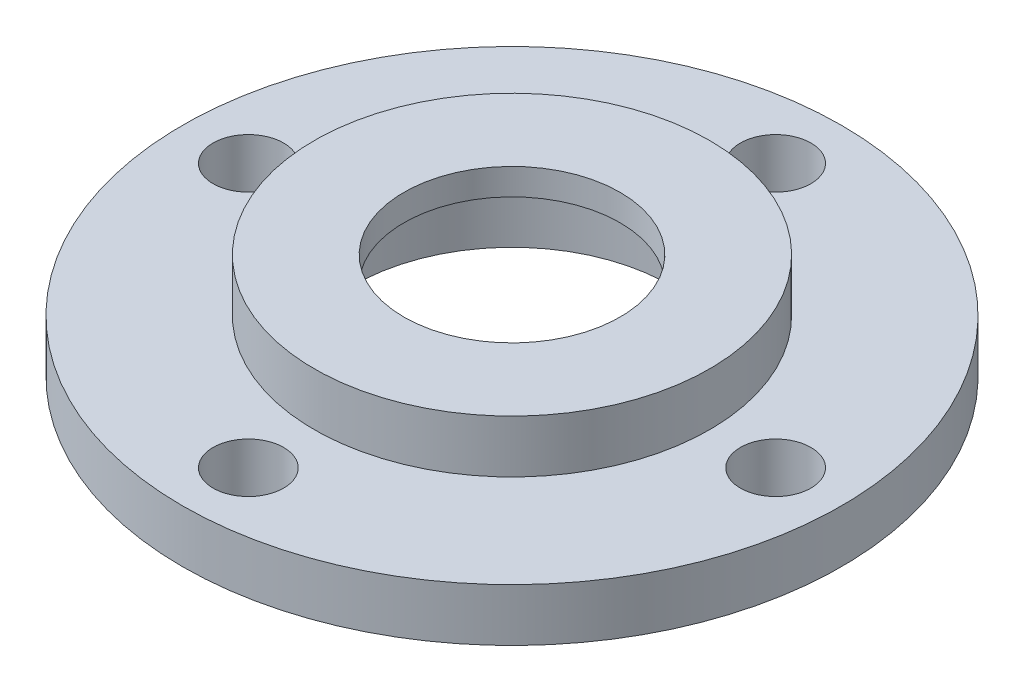
ISO-10303-21;
HEADER;
FILE_DESCRIPTION(('STEP AP214'),'2;1');
FILE_NAME('part.step','',(''),(''),'','','');
FILE_SCHEMA(('AUTOMOTIVE_DESIGN { 1 0 10303 214 1 1 1 1 }'));
ENDSEC;
DATA;
#1=APPLICATION_CONTEXT('core data for automotive mechanical design processes');
#2=APPLICATION_PROTOCOL_DEFINITION('international standard','automotive_design',2000,#1);
#3=PRODUCT_CONTEXT('',#1,'mechanical');
#4=PRODUCT('Part','Part','',(#3));
#5=PRODUCT_RELATED_PRODUCT_CATEGORY('part','',(#4));
#6=PRODUCT_DEFINITION_FORMATION('','',#4);
#7=PRODUCT_DEFINITION_CONTEXT('part definition',#1,'design');
#8=PRODUCT_DEFINITION('design','',#6,#7);
#9=PRODUCT_DEFINITION_SHAPE('','',#8);
#10=(LENGTH_UNIT() NAMED_UNIT(*) SI_UNIT(.MILLI.,.METRE.));
#11=(NAMED_UNIT(*) PLANE_ANGLE_UNIT() SI_UNIT($,.RADIAN.));
#12=(NAMED_UNIT(*) SI_UNIT($,.STERADIAN.) SOLID_ANGLE_UNIT());
#13=UNCERTAINTY_MEASURE_WITH_UNIT(LENGTH_MEASURE(1.E-05),#10,'distance_accuracy_value','');
#14=(GEOMETRIC_REPRESENTATION_CONTEXT(3) GLOBAL_UNCERTAINTY_ASSIGNED_CONTEXT((#13)) GLOBAL_UNIT_ASSIGNED_CONTEXT((#10,
#11,#12)) REPRESENTATION_CONTEXT('',''));
#15=CARTESIAN_POINT('',(0.,0.,0.));
#16=DIRECTION('',(0.,0.,1.));
#17=DIRECTION('',(1.,0.,0.));
#18=AXIS2_PLACEMENT_3D('',#15,#16,#17);
#19=CARTESIAN_POINT('',(0.,2.54,0.));
#20=DIRECTION('',(0.,-1.,0.));
#21=DIRECTION('',(0.,0.,1.));
#22=AXIS2_PLACEMENT_3D('',#19,#20,#21);
#23=CYLINDRICAL_SURFACE('',#22,15.875);
#24=CARTESIAN_POINT('',(0.,2.54,0.));
#25=DIRECTION('',(0.,-1.,0.));
#26=DIRECTION('',(0.,0.,-1.));
#27=AXIS2_PLACEMENT_3D('',#24,#25,#26);
#28=CIRCLE('',#27,15.875);
#29=CARTESIAN_POINT('',(0.,2.54,-15.875));
#30=VERTEX_POINT('',#29);
#31=EDGE_CURVE('E41',#30,#30,#28,.T.);
#32=ORIENTED_EDGE('',*,*,#31,.T.);
#33=EDGE_LOOP('',(#32));
#34=FACE_BOUND('',#33,.T.);
#35=CARTESIAN_POINT('',(0.,0.,0.));
#36=DIRECTION('',(0.,-1.,0.));
#37=DIRECTION('',(0.,0.,-1.));
#38=AXIS2_PLACEMENT_3D('',#35,#36,#37);
#39=CIRCLE('',#38,15.875);
#40=CARTESIAN_POINT('',(0.,0.,-15.875));
#41=VERTEX_POINT('',#40);
#42=EDGE_CURVE('E37',#41,#41,#39,.T.);
#43=ORIENTED_EDGE('',*,*,#42,.F.);
#44=EDGE_LOOP('',(#43));
#45=FACE_BOUND('',#44,.T.);
#46=ADVANCED_FACE('F34',(#34,#45),#23,.T.);
#47=CARTESIAN_POINT('',(0.,2.54,0.));
#48=DIRECTION('',(0.,1.,0.));
#49=DIRECTION('',(0.,0.,-1.));
#50=AXIS2_PLACEMENT_3D('',#47,#48,#49);
#51=PLANE('',#50);
#52=CARTESIAN_POINT('',(0.,2.54,12.7));
#53=DIRECTION('',(0.,-1.,0.));
#54=DIRECTION('',(0.,0.,-1.));
#55=AXIS2_PLACEMENT_3D('',#52,#53,#54);
#56=CIRCLE('',#55,1.7);
#57=CARTESIAN_POINT('',(0.,2.54,11.));
#58=VERTEX_POINT('',#57);
#59=EDGE_CURVE('E79',#58,#58,#56,.T.);
#60=ORIENTED_EDGE('',*,*,#59,.T.);
#61=EDGE_LOOP('',(#60));
#62=FACE_BOUND('',#61,.T.);
#63=CARTESIAN_POINT('',(12.7,2.54,0.));
#64=DIRECTION('',(0.,-1.,0.));
#65=DIRECTION('',(0.,0.,-1.));
#66=AXIS2_PLACEMENT_3D('',#63,#64,#65);
#67=CIRCLE('',#66,1.70000000000004);
#68=CARTESIAN_POINT('',(12.7,2.54,-1.70000000000004));
#69=VERTEX_POINT('',#68);
#70=EDGE_CURVE('E76',#69,#69,#67,.T.);
#71=ORIENTED_EDGE('',*,*,#70,.T.);
#72=EDGE_LOOP('',(#71));
#73=FACE_BOUND('',#72,.T.);
#74=CARTESIAN_POINT('',(0.,2.54,-12.7));
#75=DIRECTION('',(0.,-1.,0.));
#76=DIRECTION('',(0.,0.,-1.));
#77=AXIS2_PLACEMENT_3D('',#74,#75,#76);
#78=CIRCLE('',#77,1.7);
#79=CARTESIAN_POINT('',(0.,2.54,-14.4));
#80=VERTEX_POINT('',#79);
#81=EDGE_CURVE('E70',#80,#80,#78,.T.);
#82=ORIENTED_EDGE('',*,*,#81,.T.);
#83=EDGE_LOOP('',(#82));
#84=FACE_BOUND('',#83,.T.);
#85=CARTESIAN_POINT('',(-12.7,2.54,0.));
#86=DIRECTION('',(0.,-1.,0.));
#87=DIRECTION('',(0.,0.,-1.));
#88=AXIS2_PLACEMENT_3D('',#85,#86,#87);
#89=CIRCLE('',#88,1.7);
#90=CARTESIAN_POINT('',(-12.7,2.54,-1.7));
#91=VERTEX_POINT('',#90);
#92=EDGE_CURVE('E63',#91,#91,#89,.T.);
#93=ORIENTED_EDGE('',*,*,#92,.T.);
#94=EDGE_LOOP('',(#93));
#95=FACE_BOUND('',#94,.T.);
#96=CARTESIAN_POINT('',(0.,2.54,0.));
#97=DIRECTION('',(0.,-1.,0.));
#98=DIRECTION('',(0.,0.,-1.));
#99=AXIS2_PLACEMENT_3D('',#96,#97,#98);
#100=CIRCLE('',#99,9.525);
#101=CARTESIAN_POINT('',(0.,2.54,-9.525));
#102=VERTEX_POINT('',#101);
#103=EDGE_CURVE('E10',#102,#102,#100,.T.);
#104=ORIENTED_EDGE('',*,*,#103,.T.);
#105=EDGE_LOOP('',(#104));
#106=FACE_BOUND('',#105,.T.);
#107=ORIENTED_EDGE('',*,*,#31,.F.);
#108=EDGE_LOOP('',(#107));
#109=FACE_BOUND('',#108,.T.);
#110=ADVANCED_FACE('F87',(#62,#73,#84,#95,#106,#109),#51,.T.);
#111=CARTESIAN_POINT('',(0.,0.,0.));
#112=DIRECTION('',(0.,1.,0.));
#113=DIRECTION('',(0.,0.,-1.));
#114=AXIS2_PLACEMENT_3D('',#111,#112,#113);
#115=PLANE('',#114);
#116=CARTESIAN_POINT('',(0.,0.,12.7));
#117=DIRECTION('',(0.,-1.,0.));
#118=DIRECTION('',(0.,0.,-1.));
#119=AXIS2_PLACEMENT_3D('',#116,#117,#118);
#120=CIRCLE('',#119,1.7);
#121=CARTESIAN_POINT('',(0.,0.,11.));
#122=VERTEX_POINT('',#121);
#123=EDGE_CURVE('E60',#122,#122,#120,.F.);
#124=ORIENTED_EDGE('',*,*,#123,.T.);
#125=EDGE_LOOP('',(#124));
#126=FACE_BOUND('',#125,.T.);
#127=CARTESIAN_POINT('',(12.7,0.,0.));
#128=DIRECTION('',(0.,-1.,0.));
#129=DIRECTION('',(0.,0.,-1.));
#130=AXIS2_PLACEMENT_3D('',#127,#128,#129);
#131=CIRCLE('',#130,1.70000000000004);
#132=CARTESIAN_POINT('',(12.7,0.,-1.70000000000004));
#133=VERTEX_POINT('',#132);
#134=EDGE_CURVE('E73',#133,#133,#131,.F.);
#135=ORIENTED_EDGE('',*,*,#134,.T.);
#136=EDGE_LOOP('',(#135));
#137=FACE_BOUND('',#136,.T.);
#138=CARTESIAN_POINT('',(0.,0.,-12.7));
#139=DIRECTION('',(0.,-1.,0.));
#140=DIRECTION('',(0.,0.,-1.));
#141=AXIS2_PLACEMENT_3D('',#138,#139,#140);
#142=CIRCLE('',#141,1.7);
#143=CARTESIAN_POINT('',(0.,0.,-14.4));
#144=VERTEX_POINT('',#143);
#145=EDGE_CURVE('E66',#144,#144,#142,.F.);
#146=ORIENTED_EDGE('',*,*,#145,.T.);
#147=EDGE_LOOP('',(#146));
#148=FACE_BOUND('',#147,.T.);
#149=CARTESIAN_POINT('',(-12.7,0.,0.));
#150=DIRECTION('',(0.,-1.,0.));
#151=DIRECTION('',(0.,0.,-1.));
#152=AXIS2_PLACEMENT_3D('',#149,#150,#151);
#153=CIRCLE('',#152,1.7);
#154=CARTESIAN_POINT('',(-12.7,0.,-1.7));
#155=VERTEX_POINT('',#154);
#156=EDGE_CURVE('E67',#155,#155,#153,.F.);
#157=ORIENTED_EDGE('',*,*,#156,.T.);
#158=EDGE_LOOP('',(#157));
#159=FACE_BOUND('',#158,.T.);
#160=CARTESIAN_POINT('',(0.,0.,0.));
#161=DIRECTION('',(0.,1.,0.));
#162=DIRECTION('',(0.,0.,1.));
#163=AXIS2_PLACEMENT_3D('',#160,#161,#162);
#164=CIRCLE('',#163,7.62);
#165=CARTESIAN_POINT('',(0.,0.,7.62));
#166=VERTEX_POINT('',#165);
#167=EDGE_CURVE('E51',#166,#166,#164,.T.);
#168=ORIENTED_EDGE('',*,*,#167,.T.);
#169=EDGE_LOOP('',(#168));
#170=FACE_BOUND('',#169,.T.);
#171=ORIENTED_EDGE('',*,*,#42,.T.);
#172=EDGE_LOOP('',(#171));
#173=FACE_BOUND('',#172,.T.);
#174=ADVANCED_FACE('F97',(#126,#137,#148,#159,#170,#173),#115,.F.);
#175=CARTESIAN_POINT('',(0.,5.08,0.));
#176=DIRECTION('',(0.,-1.,0.));
#177=DIRECTION('',(0.,0.,1.));
#178=AXIS2_PLACEMENT_3D('',#175,#176,#177);
#179=CYLINDRICAL_SURFACE('',#178,9.525);
#180=CARTESIAN_POINT('',(0.,5.08,0.));
#181=DIRECTION('',(0.,-1.,0.));
#182=DIRECTION('',(0.,0.,-1.));
#183=AXIS2_PLACEMENT_3D('',#180,#181,#182);
#184=CIRCLE('',#183,9.525);
#185=CARTESIAN_POINT('',(0.,5.08,-9.525));
#186=VERTEX_POINT('',#185);
#187=EDGE_CURVE('E47',#186,#186,#184,.T.);
#188=ORIENTED_EDGE('',*,*,#187,.T.);
#189=EDGE_LOOP('',(#188));
#190=FACE_BOUND('',#189,.T.);
#191=ORIENTED_EDGE('',*,*,#103,.F.);
#192=EDGE_LOOP('',(#191));
#193=FACE_BOUND('',#192,.T.);
#194=ADVANCED_FACE('F100',(#190,#193),#179,.T.);
#195=CARTESIAN_POINT('',(0.,5.08,0.));
#196=DIRECTION('',(0.,1.,0.));
#197=DIRECTION('',(0.,0.,-1.));
#198=AXIS2_PLACEMENT_3D('',#195,#196,#197);
#199=PLANE('',#198);
#200=CARTESIAN_POINT('',(0.,5.08,0.));
#201=DIRECTION('',(0.,-1.,0.));
#202=DIRECTION('',(0.,0.,-1.));
#203=AXIS2_PLACEMENT_3D('',#200,#201,#202);
#204=CIRCLE('',#203,5.207);
#205=CARTESIAN_POINT('',(0.,5.08,-5.207));
#206=VERTEX_POINT('',#205);
#207=EDGE_CURVE('E54',#206,#206,#204,.T.);
#208=ORIENTED_EDGE('',*,*,#207,.T.);
#209=EDGE_LOOP('',(#208));
#210=FACE_BOUND('',#209,.T.);
#211=ORIENTED_EDGE('',*,*,#187,.F.);
#212=EDGE_LOOP('',(#211));
#213=FACE_BOUND('',#212,.T.);
#214=ADVANCED_FACE('F125',(#210,#213),#199,.T.);
#215=CARTESIAN_POINT('',(0.,3.81,0.));
#216=DIRECTION('',(0.,-1.,0.));
#217=DIRECTION('',(0.,0.,1.));
#218=AXIS2_PLACEMENT_3D('',#215,#216,#217);
#219=CYLINDRICAL_SURFACE('',#218,7.62);
#220=CARTESIAN_POINT('',(0.,3.81,0.));
#221=DIRECTION('',(0.,1.,0.));
#222=DIRECTION('',(0.,0.,1.));
#223=AXIS2_PLACEMENT_3D('',#220,#221,#222);
#224=CIRCLE('',#223,7.62);
#225=CARTESIAN_POINT('',(0.,3.81,7.62));
#226=VERTEX_POINT('',#225);
#227=EDGE_CURVE('E50',#226,#226,#224,.T.);
#228=CARTESIAN_POINT('',(0.,3.81,7.62));
#229=CARTESIAN_POINT('',(0.,3.7703125,7.62));
#230=CARTESIAN_POINT('',(0.,3.730625,7.62));
#231=CARTESIAN_POINT('',(0.,3.65125,7.62));
#232=CARTESIAN_POINT('',(0.,3.6115625,7.62));
#233=CARTESIAN_POINT('',(0.,3.5321875,7.62));
#234=CARTESIAN_POINT('',(0.,3.4925,7.62));
#235=CARTESIAN_POINT('',(0.,3.413125,7.62));
#236=CARTESIAN_POINT('',(0.,3.3734375,7.62));
#237=CARTESIAN_POINT('',(0.,3.2940625,7.62));
#238=CARTESIAN_POINT('',(0.,3.254375,7.62));
#239=CARTESIAN_POINT('',(0.,3.175,7.62));
#240=CARTESIAN_POINT('',(0.,3.1353125,7.62));
#241=CARTESIAN_POINT('',(0.,3.0559375,7.62));
#242=CARTESIAN_POINT('',(0.,3.01625,7.62));
#243=CARTESIAN_POINT('',(0.,2.936875,7.62));
#244=CARTESIAN_POINT('',(0.,2.8971875,7.62));
#245=CARTESIAN_POINT('',(0.,2.8178125,7.62));
#246=CARTESIAN_POINT('',(0.,2.778125,7.62));
#247=CARTESIAN_POINT('',(0.,2.69875,7.62));
#248=CARTESIAN_POINT('',(0.,2.6590625,7.62));
#249=CARTESIAN_POINT('',(0.,2.5796875,7.62));
#250=CARTESIAN_POINT('',(0.,2.54,7.62));
#251=CARTESIAN_POINT('',(0.,2.460625,7.62));
#252=CARTESIAN_POINT('',(0.,2.4209375,7.62));
#253=CARTESIAN_POINT('',(0.,2.3415625,7.62));
#254=CARTESIAN_POINT('',(0.,2.301875,7.62));
#255=CARTESIAN_POINT('',(0.,2.2225,7.62));
#256=CARTESIAN_POINT('',(0.,2.1828125,7.62));
#257=CARTESIAN_POINT('',(0.,2.1034375,7.62));
#258=CARTESIAN_POINT('',(0.,2.06375,7.62));
#259=CARTESIAN_POINT('',(0.,1.984375,7.62));
#260=CARTESIAN_POINT('',(0.,1.9446875,7.62));
#261=CARTESIAN_POINT('',(0.,1.8653125,7.62));
#262=CARTESIAN_POINT('',(0.,1.825625,7.62));
#263=CARTESIAN_POINT('',(0.,1.74625,7.62));
#264=CARTESIAN_POINT('',(0.,1.7065625,7.62));
#265=CARTESIAN_POINT('',(0.,1.6271875,7.62));
#266=CARTESIAN_POINT('',(0.,1.5875,7.62));
#267=CARTESIAN_POINT('',(0.,1.508125,7.62));
#268=CARTESIAN_POINT('',(0.,1.4684375,7.62));
#269=CARTESIAN_POINT('',(0.,1.3890625,7.62));
#270=CARTESIAN_POINT('',(0.,1.349375,7.62));
#271=CARTESIAN_POINT('',(0.,1.27,7.62));
#272=CARTESIAN_POINT('',(0.,1.2303125,7.62));
#273=CARTESIAN_POINT('',(0.,1.1509375,7.62));
#274=CARTESIAN_POINT('',(0.,1.11125,7.62));
#275=CARTESIAN_POINT('',(0.,1.031875,7.62));
#276=CARTESIAN_POINT('',(0.,0.9921875,7.62));
#277=CARTESIAN_POINT('',(0.,0.9128125,7.62));
#278=CARTESIAN_POINT('',(0.,0.873125,7.62));
#279=CARTESIAN_POINT('',(0.,0.79375,7.62));
#280=CARTESIAN_POINT('',(0.,0.7540625,7.62));
#281=CARTESIAN_POINT('',(0.,0.6746875,7.62));
#282=CARTESIAN_POINT('',(0.,0.635,7.62));
#283=CARTESIAN_POINT('',(0.,0.555625,7.62));
#284=CARTESIAN_POINT('',(0.,0.5159375,7.62));
#285=CARTESIAN_POINT('',(0.,0.4365625,7.62));
#286=CARTESIAN_POINT('',(0.,0.396875,7.62));
#287=CARTESIAN_POINT('',(0.,0.3175,7.62));
#288=CARTESIAN_POINT('',(0.,0.2778125,7.62));
#289=CARTESIAN_POINT('',(0.,0.1984375,7.62));
#290=CARTESIAN_POINT('',(0.,0.15875,7.62));
#291=CARTESIAN_POINT('',(0.,0.0793749999999999,7.62));
#292=CARTESIAN_POINT('',(0.,0.0396874999999999,7.62));
#293=CARTESIAN_POINT('',(0.,0.,7.62));
#294=B_SPLINE_CURVE_WITH_KNOTS('',3,(#228,#229,#230,#231,#232,#233,#234,#235,#236,#237,#238,
#239,#240,#241,#242,#243,#244,#245,#246,#247,#248,#249,#250,#251,#252,#253,#254,#255,#256,#257,
#258,#259,#260,#261,#262,#263,#264,#265,#266,#267,#268,#269,#270,#271,#272,#273,#274,#275,#276,
#277,#278,#279,#280,#281,#282,#283,#284,#285,#286,#287,#288,#289,#290,#291,#292,#293),
.UNSPECIFIED.,.F.,.F.,(4,2,2,2,2,2,2,2,2,2,2,2,2,2,2,2,2,2,2,2,2,2,2,2,2,2,2,2,2,2,2,2,4),(0.,
0.1190625,0.238125,0.3571875,0.47625,0.5953125,0.714375,0.8334375,0.9525,1.0715625,1.190625,
1.3096875,1.42875,1.5478125,1.666875,1.7859375,1.905,2.0240625,2.143125,2.2621875,2.38125,
2.5003125,2.619375,2.7384375,2.8575,2.9765625,3.095625,3.2146875,3.33375,3.4528125,3.571875,
3.6909375,3.81),.UNSPECIFIED.);
#295=EDGE_CURVE('BSEAM129',#226,#166,#294,.T.);
#296=ORIENTED_EDGE('',*,*,#227,.T.);
#297=ORIENTED_EDGE('',*,*,#167,.F.);
#298=ORIENTED_EDGE('',*,*,#295,.T.);
#299=ORIENTED_EDGE('',*,*,#295,.F.);
#300=EDGE_LOOP('',(#296,#298,#297,#299));
#301=FACE_BOUND('',#300,.T.);
#302=ADVANCED_FACE('F129',(#301),#219,.F.);
#303=CARTESIAN_POINT('',(0.,3.81,0.));
#304=DIRECTION('',(0.,-1.,0.));
#305=DIRECTION('',(0.,0.,1.));
#306=AXIS2_PLACEMENT_3D('',#303,#304,#305);
#307=PLANE('',#306);
#308=CARTESIAN_POINT('',(0.,3.81,0.));
#309=DIRECTION('',(0.,1.,0.));
#310=DIRECTION('',(0.,0.,1.));
#311=AXIS2_PLACEMENT_3D('',#308,#309,#310);
#312=CIRCLE('',#311,5.207);
#313=CARTESIAN_POINT('',(0.,3.81,5.207));
#314=VERTEX_POINT('',#313);
#315=EDGE_CURVE('E57',#314,#314,#312,.F.);
#316=ORIENTED_EDGE('',*,*,#315,.F.);
#317=EDGE_LOOP('',(#316));
#318=FACE_BOUND('',#317,.T.);
#319=ORIENTED_EDGE('',*,*,#227,.F.);
#320=EDGE_LOOP('',(#319));
#321=FACE_BOUND('',#320,.T.);
#322=ADVANCED_FACE('F133',(#318,#321),#307,.T.);
#323=CARTESIAN_POINT('',(0.,-0.00100000000000013,0.));
#324=DIRECTION('',(0.,1.,0.));
#325=DIRECTION('',(0.,0.,-1.));
#326=AXIS2_PLACEMENT_3D('',#323,#324,#325);
#327=CYLINDRICAL_SURFACE('',#326,5.207);
#328=ORIENTED_EDGE('',*,*,#315,.T.);
#329=EDGE_LOOP('',(#328));
#330=FACE_BOUND('',#329,.T.);
#331=ORIENTED_EDGE('',*,*,#207,.F.);
#332=EDGE_LOOP('',(#331));
#333=FACE_BOUND('',#332,.T.);
#334=ADVANCED_FACE('F137',(#330,#333),#327,.F.);
#335=CARTESIAN_POINT('',(-12.7,-0.00100000000000013,0.));
#336=DIRECTION('',(0.,1.,0.));
#337=DIRECTION('',(0.,0.,-1.));
#338=AXIS2_PLACEMENT_3D('',#335,#336,#337);
#339=CYLINDRICAL_SURFACE('',#338,1.7);
#340=ORIENTED_EDGE('',*,*,#92,.F.);
#341=EDGE_LOOP('',(#340));
#342=FACE_BOUND('',#341,.T.);
#343=ORIENTED_EDGE('',*,*,#156,.F.);
#344=EDGE_LOOP('',(#343));
#345=FACE_BOUND('',#344,.T.);
#346=ADVANCED_FACE('F141',(#342,#345),#339,.F.);
#347=CARTESIAN_POINT('',(0.,-0.00100000000000013,-12.7));
#348=DIRECTION('',(0.,1.,0.));
#349=DIRECTION('',(0.,0.,-1.));
#350=AXIS2_PLACEMENT_3D('',#347,#348,#349);
#351=CYLINDRICAL_SURFACE('',#350,1.7);
#352=ORIENTED_EDGE('',*,*,#81,.F.);
#353=EDGE_LOOP('',(#352));
#354=FACE_BOUND('',#353,.T.);
#355=ORIENTED_EDGE('',*,*,#145,.F.);
#356=EDGE_LOOP('',(#355));
#357=FACE_BOUND('',#356,.T.);
#358=ADVANCED_FACE('F145',(#354,#357),#351,.F.);
#359=CARTESIAN_POINT('',(12.7,-0.00100000000000013,0.));
#360=DIRECTION('',(0.,1.,0.));
#361=DIRECTION('',(0.,0.,-1.));
#362=AXIS2_PLACEMENT_3D('',#359,#360,#361);
#363=CYLINDRICAL_SURFACE('',#362,1.70000000000004);
#364=ORIENTED_EDGE('',*,*,#70,.F.);
#365=EDGE_LOOP('',(#364));
#366=FACE_BOUND('',#365,.T.);
#367=ORIENTED_EDGE('',*,*,#134,.F.);
#368=EDGE_LOOP('',(#367));
#369=FACE_BOUND('',#368,.T.);
#370=ADVANCED_FACE('F93',(#366,#369),#363,.F.);
#371=CARTESIAN_POINT('',(0.,-0.00100000000000013,12.7));
#372=DIRECTION('',(0.,1.,0.));
#373=DIRECTION('',(0.,0.,-1.));
#374=AXIS2_PLACEMENT_3D('',#371,#372,#373);
#375=CYLINDRICAL_SURFACE('',#374,1.7);
#376=ORIENTED_EDGE('',*,*,#59,.F.);
#377=EDGE_LOOP('',(#376));
#378=FACE_BOUND('',#377,.T.);
#379=ORIENTED_EDGE('',*,*,#123,.F.);
#380=EDGE_LOOP('',(#379));
#381=FACE_BOUND('',#380,.T.);
#382=ADVANCED_FACE('F90',(#378,#381),#375,.F.);
#383=CLOSED_SHELL('',(#46,#110,#174,#194,#214,#302,#322,#334,#346,#358,#370,#382));
#384=MANIFOLD_SOLID_BREP('B2',#383);
#385=ADVANCED_BREP_SHAPE_REPRESENTATION('',(#18,#384),#14);
#386=SHAPE_DEFINITION_REPRESENTATION(#9,#385);
ENDSEC;
END-ISO-10303-21;
